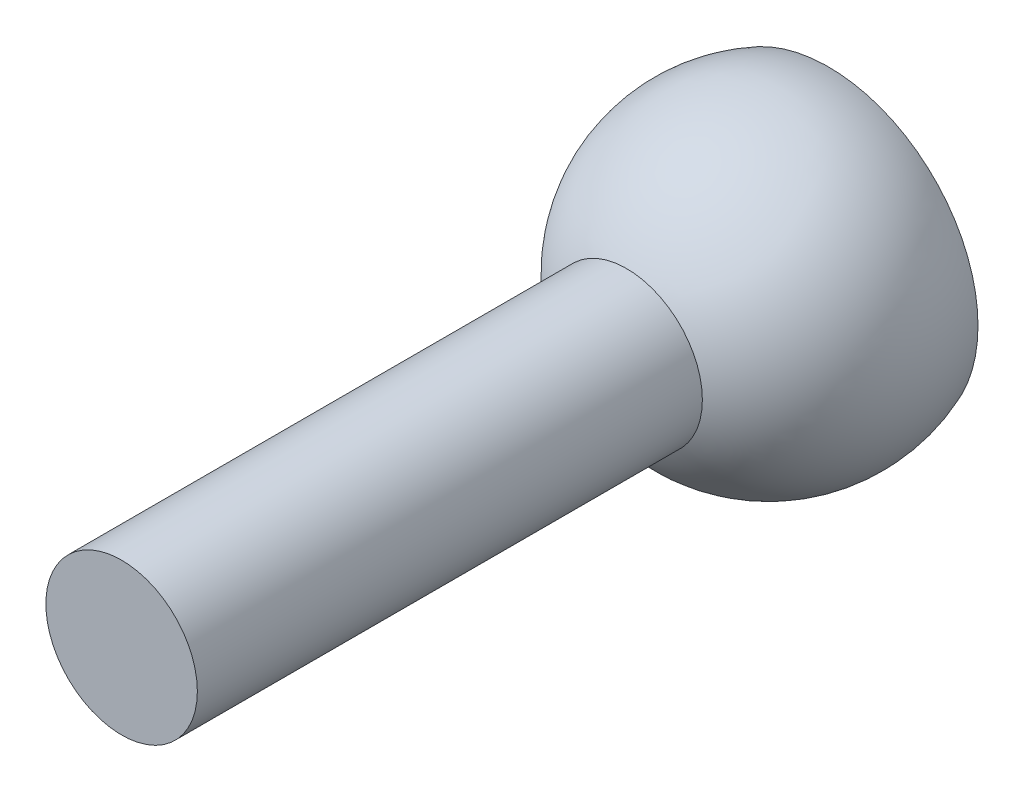
ISO-10303-21;
HEADER;
FILE_DESCRIPTION(('STEP AP214'),'2;1');
FILE_NAME('part.step','',(''),(''),'','','');
FILE_SCHEMA(('AUTOMOTIVE_DESIGN { 1 0 10303 214 1 1 1 1 }'));
ENDSEC;
DATA;
#1=APPLICATION_CONTEXT('core data for automotive mechanical design processes');
#2=APPLICATION_PROTOCOL_DEFINITION('international standard','automotive_design',2000,#1);
#3=PRODUCT_CONTEXT('',#1,'mechanical');
#4=PRODUCT('Part','Part','',(#3));
#5=PRODUCT_RELATED_PRODUCT_CATEGORY('part','',(#4));
#6=PRODUCT_DEFINITION_FORMATION('','',#4);
#7=PRODUCT_DEFINITION_CONTEXT('part definition',#1,'design');
#8=PRODUCT_DEFINITION('design','',#6,#7);
#9=PRODUCT_DEFINITION_SHAPE('','',#8);
#10=(LENGTH_UNIT() NAMED_UNIT(*) SI_UNIT(.MILLI.,.METRE.));
#11=(NAMED_UNIT(*) PLANE_ANGLE_UNIT() SI_UNIT($,.RADIAN.));
#12=(NAMED_UNIT(*) SI_UNIT($,.STERADIAN.) SOLID_ANGLE_UNIT());
#13=UNCERTAINTY_MEASURE_WITH_UNIT(LENGTH_MEASURE(1.E-05),#10,'distance_accuracy_value','');
#14=(GEOMETRIC_REPRESENTATION_CONTEXT(3) GLOBAL_UNCERTAINTY_ASSIGNED_CONTEXT((#13)) GLOBAL_UNIT_ASSIGNED_CONTEXT((#10,
#11,#12)) REPRESENTATION_CONTEXT('',''));
#15=CARTESIAN_POINT('',(0.,0.,0.));
#16=DIRECTION('',(0.,0.,1.));
#17=DIRECTION('',(1.,0.,0.));
#18=AXIS2_PLACEMENT_3D('',#15,#16,#17);
#19=CARTESIAN_POINT('',(0.,0.,10.));
#20=DIRECTION('',(0.,0.,-1.));
#21=DIRECTION('',(-1.,0.,0.));
#22=AXIS2_PLACEMENT_3D('',#19,#20,#21);
#23=CYLINDRICAL_SURFACE('',#22,1.5);
#24=CARTESIAN_POINT('',(0.,0.,10.));
#25=DIRECTION('',(0.,0.,1.));
#26=DIRECTION('',(1.,0.,0.));
#27=AXIS2_PLACEMENT_3D('',#24,#25,#26);
#28=CIRCLE('',#27,1.5);
#29=CARTESIAN_POINT('',(1.5,0.,10.));
#30=VERTEX_POINT('',#29);
#31=EDGE_CURVE('E10',#30,#30,#28,.T.);
#32=ORIENTED_EDGE('',*,*,#31,.F.);
#33=EDGE_LOOP('',(#32));
#34=FACE_BOUND('',#33,.T.);
#35=CARTESIAN_POINT('',(0.,0.,0.));
#36=DIRECTION('',(0.,0.,1.));
#37=DIRECTION('',(1.,0.,0.));
#38=AXIS2_PLACEMENT_3D('',#35,#36,#37);
#39=CIRCLE('',#38,1.5);
#40=CARTESIAN_POINT('',(1.5,0.,0.));
#41=VERTEX_POINT('',#40);
#42=EDGE_CURVE('E41',#41,#41,#39,.T.);
#43=ORIENTED_EDGE('',*,*,#42,.T.);
#44=EDGE_LOOP('',(#43));
#45=FACE_BOUND('',#44,.T.);
#46=ADVANCED_FACE('F33',(#34,#45),#23,.T.);
#47=CARTESIAN_POINT('',(0.,0.,10.));
#48=DIRECTION('',(0.,0.,1.));
#49=DIRECTION('',(1.,0.,0.));
#50=AXIS2_PLACEMENT_3D('',#47,#48,#49);
#51=PLANE('',#50);
#52=ORIENTED_EDGE('',*,*,#31,.T.);
#53=EDGE_LOOP('',(#52));
#54=FACE_BOUND('',#53,.T.);
#55=ADVANCED_FACE('F73',(#54),#51,.T.);
#56=CARTESIAN_POINT('',(0.,0.,-2.8125));
#57=DIRECTION('',(0.,0.,1.));
#58=DIRECTION('',(1.,0.,0.));
#59=AXIS2_PLACEMENT_3D('',#56,#57,#58);
#60=SPHERICAL_SURFACE('',#59,3.1875);
#61=CARTESIAN_POINT('',(0.,0.,-4.));
#62=DIRECTION('',(0.,0.,1.));
#63=DIRECTION('',(1.,0.,0.));
#64=AXIS2_PLACEMENT_3D('',#61,#62,#63);
#65=CIRCLE('',#64,2.95803989154981);
#66=CARTESIAN_POINT('',(2.95803989154981,0.,-4.));
#67=VERTEX_POINT('',#66);
#68=EDGE_CURVE('E37',#67,#67,#65,.T.);
#69=CARTESIAN_POINT('',(2.95803989154981,0.,-4.));
#70=CARTESIAN_POINT('',(2.97613265108618,0.,-3.95493351295893));
#71=CARTESIAN_POINT('',(2.9931939582805,0.,-3.90945302215849));
#72=CARTESIAN_POINT('',(3.02522148361788,0.,-3.81776023265633));
#73=CARTESIAN_POINT('',(3.04018770176093,0.,-3.7715479339546));
#74=CARTESIAN_POINT('',(3.06799286462857,0.,-3.6784877282673));
#75=CARTESIAN_POINT('',(3.08083180935316,0.,-3.63163982128173));
#76=CARTESIAN_POINT('',(3.10435585674361,0.,-3.53740633578886));
#77=CARTESIAN_POINT('',(3.11504095940948,0.,-3.49002075728156));
#78=CARTESIAN_POINT('',(3.13423493854528,0.,-3.39481087878805));
#79=CARTESIAN_POINT('',(3.14274381501522,0.,-3.34698657880184));
#80=CARTESIAN_POINT('',(3.15756758724297,0.,-3.25099915314675));
#81=CARTESIAN_POINT('',(3.16388248300078,0.,-3.20283602747787));
#82=CARTESIAN_POINT('',(3.17430509925104,0.,-3.10627154607242));
#83=CARTESIAN_POINT('',(3.1784128197435,0.,-3.05787019033584));
#84=CARTESIAN_POINT('',(3.18441250703331,0.,-2.96093034410718));
#85=CARTESIAN_POINT('',(3.18630447383065,0.,-2.91239185361509));
#86=CARTESIAN_POINT('',(3.1878687016778,0.,-2.8152791190523));
#87=CARTESIAN_POINT('',(3.18754096272761,0.,-2.76670487498159));
#88=CARTESIAN_POINT('',(3.18466646371267,0.,-2.66962208926774));
#89=CARTESIAN_POINT('',(3.18211970364791,0.,-2.6211135476246));
#90=CARTESIAN_POINT('',(3.17481248174198,0.,-2.52426348550022));
#91=CARTESIAN_POINT('',(3.17005201990081,0.,-2.47592196501898));
#92=CARTESIAN_POINT('',(3.15832733752244,0.,-2.37950691511014));
#93=CARTESIAN_POINT('',(3.15136311698524,0.,-2.33143338568254));
#94=CARTESIAN_POINT('',(3.13524546323002,0.,-2.23565472802265));
#95=CARTESIAN_POINT('',(3.12609203001201,0.,-2.18794959979036));
#96=CARTESIAN_POINT('',(3.10561506947383,0.,-2.09300738519195));
#97=CARTESIAN_POINT('',(3.09429154215367,0.,-2.04577029882584));
#98=CARTESIAN_POINT('',(3.06949804461797,0.,-1.95186283104148));
#99=CARTESIAN_POINT('',(3.05602807440242,0.,-1.90519244962324));
#100=CARTESIAN_POINT('',(3.02696982551174,0.,-1.81251587115202));
#101=CARTESIAN_POINT('',(3.0113815468366,0.,-1.76650967409903));
#102=CARTESIAN_POINT('',(2.97811923992763,0.,-1.67525755650816));
#103=CARTESIAN_POINT('',(2.9604452116938,0.,-1.63001163597027));
#104=CARTESIAN_POINT('',(2.92304832102835,0.,-1.54037457558629));
#105=CARTESIAN_POINT('',(2.90332545859675,0.,-1.49598343574019));
#106=CARTESIAN_POINT('',(2.86187209425241,0.,-1.40814865555455));
#107=CARTESIAN_POINT('',(2.84014159233967,0.,-1.36470501521502));
#108=CARTESIAN_POINT('',(2.794718337063,0.,-1.27885597383539));
#109=CARTESIAN_POINT('',(2.77102558369907,0.,-1.23645057279529));
#110=CARTESIAN_POINT('',(2.72172731206183,0.,-1.15276658125996));
#111=CARTESIAN_POINT('',(2.69612179378852,0.,-1.11148799076474));
#112=CARTESIAN_POINT('',(2.6430514740263,0.,-1.0301438380177));
#113=CARTESIAN_POINT('',(2.61558667253739,0.,-0.990078275765885));
#114=CARTESIAN_POINT('',(2.55885515147791,0.,-0.911243863585951));
#115=CARTESIAN_POINT('',(2.52958843190733,0.,-0.872475013657828));
#116=CARTESIAN_POINT('',(2.46931420346268,0.,-0.796315001762144));
#117=CARTESIAN_POINT('',(2.43830669458861,0.,-0.758923839794583));
#118=CARTESIAN_POINT('',(2.37461565220124,0.,-0.685597302015735));
#119=CARTESIAN_POINT('',(2.34193211868796,0.,-0.649661926204447));
#120=CARTESIAN_POINT('',(2.27495729259755,0.,-0.579322017869483));
#121=CARTESIAN_POINT('',(2.24066600002042,0.,-0.544917485345807));
#122=CARTESIAN_POINT('',(2.17054727859372,0.,-0.477711124753303));
#123=CARTESIAN_POINT('',(2.13471984974415,0.,-0.444909296684474));
#124=CARTESIAN_POINT('',(2.06160369032637,0.,-0.380976853129221));
#125=CARTESIAN_POINT('',(2.02431495975817,0.,-0.349846237642795));
#126=CARTESIAN_POINT('',(1.94835407145073,0.,-0.289321257301133));
#127=CARTESIAN_POINT('',(1.90968191371149,0.,-0.259926892445895));
#128=CARTESIAN_POINT('',(1.83103498065849,0.,-0.202935748264347));
#129=CARTESIAN_POINT('',(1.79106020534474,0.,-0.175338968938035));
#130=CARTESIAN_POINT('',(1.70989139762596,0.,-0.122000862314632));
#131=CARTESIAN_POINT('',(1.66869736522093,0.,-0.0962595350175405));
#132=CARTESIAN_POINT('',(1.58517658437426,0.,-0.0466852554697158));
#133=CARTESIAN_POINT('',(1.54284983593261,0.,-0.022852303218983));
#134=CARTESIAN_POINT('',(1.5,0.,0.));
#135=B_SPLINE_CURVE_WITH_KNOTS('',3,(#69,#70,#71,#72,#73,#74,#75,#76,#77,#78,#79,#80,#81,#82,
#83,#84,#85,#86,#87,#88,#89,#90,#91,#92,#93,#94,#95,#96,#97,#98,#99,#100,#101,#102,#103,#104,
#105,#106,#107,#108,#109,#110,#111,#112,#113,#114,#115,#116,#117,#118,#119,#120,#121,#122,#123,
#124,#125,#126,#127,#128,#129,#130,#131,#132,#133,#134),.UNSPECIFIED.,.F.,.F.,(4,2,2,2,2,2,2,2,
2,2,2,2,2,2,2,2,2,2,2,2,2,2,2,2,2,2,2,2,2,2,2,2,4),(0.,0.145675319984637,0.291350639969274,
0.437025959953911,0.582701279938548,0.728376599923185,0.874051919907822,1.01972723989246,
1.1654025598771,1.31107787986173,1.45675319984637,1.60242851983101,1.74810383981564,
1.89377915980028,2.03945447978492,2.18512979976956,2.33080511975419,2.47648043973883,
2.62215575972347,2.7678310797081,2.91350639969274,3.05918171967738,3.20485703966202,
3.35053235964665,3.49620767963129,3.64188299961593,3.78755831960056,3.9332336395852,
4.07890895956984,4.22458427955448,4.37025959953911,4.51593491952375,4.66161023950839),.UNSPECIFIED.);
#136=EDGE_CURVE('BSEAM35',#67,#41,#135,.T.);
#137=ORIENTED_EDGE('',*,*,#68,.T.);
#138=ORIENTED_EDGE('',*,*,#42,.F.);
#139=ORIENTED_EDGE('',*,*,#136,.T.);
#140=ORIENTED_EDGE('',*,*,#136,.F.);
#141=EDGE_LOOP('',(#137,#139,#138,#140));
#142=FACE_BOUND('',#141,.T.);
#143=ADVANCED_FACE('F35',(#142),#60,.T.);
#144=CARTESIAN_POINT('',(0.,0.,-4.));
#145=DIRECTION('',(0.,0.,1.));
#146=DIRECTION('',(1.,0.,0.));
#147=AXIS2_PLACEMENT_3D('',#144,#145,#146);
#148=PLANE('',#147);
#149=CARTESIAN_POINT('',(0.,0.,-4.));
#150=DIRECTION('',(0.,0.,1.));
#151=DIRECTION('',(1.,0.,0.));
#152=AXIS2_PLACEMENT_3D('',#149,#150,#151);
#153=CIRCLE('',#152,2.41091269024824);
#154=CARTESIAN_POINT('',(2.41091269024824,0.,-4.));
#155=VERTEX_POINT('',#154);
#156=EDGE_CURVE('E47',#155,#155,#153,.T.);
#157=ORIENTED_EDGE('',*,*,#156,.T.);
#158=EDGE_LOOP('',(#157));
#159=FACE_BOUND('',#158,.T.);
#160=ORIENTED_EDGE('',*,*,#68,.F.);
#161=EDGE_LOOP('',(#160));
#162=FACE_BOUND('',#161,.T.);
#163=ADVANCED_FACE('F62',(#159,#162),#148,.F.);
#164=CARTESIAN_POINT('',(0.,0.,10.));
#165=DIRECTION('',(0.,0.,-1.));
#166=DIRECTION('',(-1.,0.,0.));
#167=AXIS2_PLACEMENT_3D('',#164,#165,#166);
#168=CYLINDRICAL_SURFACE('',#167,1.);
#169=CARTESIAN_POINT('',(0.,0.,9.5));
#170=DIRECTION('',(0.,0.,1.));
#171=DIRECTION('',(1.,0.,0.));
#172=AXIS2_PLACEMENT_3D('',#169,#170,#171);
#173=CIRCLE('',#172,1.);
#174=CARTESIAN_POINT('',(1.,0.,9.5));
#175=VERTEX_POINT('',#174);
#176=EDGE_CURVE('E53',#175,#175,#173,.T.);
#177=ORIENTED_EDGE('',*,*,#176,.T.);
#178=EDGE_LOOP('',(#177));
#179=FACE_BOUND('',#178,.T.);
#180=CARTESIAN_POINT('',(0.,0.,-0.317974744565612));
#181=DIRECTION('',(0.,0.,-1.));
#182=DIRECTION('',(-1.,0.,0.));
#183=AXIS2_PLACEMENT_3D('',#180,#181,#182);
#184=CIRCLE('',#183,1.);
#185=CARTESIAN_POINT('',(1.,0.,-0.317974744565612));
#186=VERTEX_POINT('',#185);
#187=EDGE_CURVE('E50',#186,#186,#184,.F.);
#188=ORIENTED_EDGE('',*,*,#187,.F.);
#189=EDGE_LOOP('',(#188));
#190=FACE_BOUND('',#189,.T.);
#191=ADVANCED_FACE('F64',(#179,#190),#168,.F.);
#192=CARTESIAN_POINT('',(0.,0.,9.5));
#193=DIRECTION('',(0.,0.,1.));
#194=DIRECTION('',(1.,0.,0.));
#195=AXIS2_PLACEMENT_3D('',#192,#193,#194);
#196=PLANE('',#195);
#197=ORIENTED_EDGE('',*,*,#176,.F.);
#198=EDGE_LOOP('',(#197));
#199=FACE_BOUND('',#198,.T.);
#200=ADVANCED_FACE('F71',(#199),#196,.F.);
#201=CARTESIAN_POINT('',(0.,0.,-2.8125));
#202=DIRECTION('',(0.,0.,1.));
#203=DIRECTION('',(1.,0.,0.));
#204=AXIS2_PLACEMENT_3D('',#201,#202,#203);
#205=SPHERICAL_SURFACE('',#204,2.6875);
#206=CARTESIAN_POINT('',(2.41091269024824,0.,-4.));
#207=CARTESIAN_POINT('',(2.43128930839686,0.,-3.9586330810894));
#208=CARTESIAN_POINT('',(2.450599198756,0.,-3.91674085540468));
#209=CARTESIAN_POINT('',(2.48703892469577,0.,-3.83201872652443));
#210=CARTESIAN_POINT('',(2.50416876027641,0.,-3.78918882332889));
#211=CARTESIAN_POINT('',(2.53620177745968,0.,-3.70270427546438));
#212=CARTESIAN_POINT('',(2.55110495906232,0.,-3.65904963079542));
#213=CARTESIAN_POINT('',(2.5786455151927,0.,-3.57103138643717));
#214=CARTESIAN_POINT('',(2.59128288972046,0.,-3.52666778674789));
#215=CARTESIAN_POINT('',(2.61425826632771,0.,-3.43734911855566));
#216=CARTESIAN_POINT('',(2.62459626840721,0.,-3.39239405005271));
#217=CARTESIAN_POINT('',(2.64294553712941,0.,-3.30201154509068));
#218=CARTESIAN_POINT('',(2.6509568037721,0.,-3.2565841086316));
#219=CARTESIAN_POINT('',(2.66463137263195,0.,-3.16537720716328));
#220=CARTESIAN_POINT('',(2.67029467484912,0.,-3.11959774215405));
#221=CARTESIAN_POINT('',(2.67925831385357,0.,-3.02780805898345));
#222=CARTESIAN_POINT('',(2.68255865064086,0.,-2.98179784082209));
#223=CARTESIAN_POINT('',(2.68678761539063,0.,-2.88966853711559));
#224=CARTESIAN_POINT('',(2.68771624335311,0.,-2.84354945157045));
#225=CARTESIAN_POINT('',(2.68719933054002,0.,-2.75132458751236));
#226=CARTESIAN_POINT('',(2.68575378976445,0.,-2.70521880899941));
#227=CARTESIAN_POINT('',(2.68049236883414,0.,-2.61314269810391));
#228=CARTESIAN_POINT('',(2.67667648867939,0.,-2.56717236572135));
#229=CARTESIAN_POINT('',(2.66668449767188,0.,-2.47548892739134));
#230=CARTESIAN_POINT('',(2.66050838681912,0.,-2.42977582144388));
#231=CARTESIAN_POINT('',(2.64581229558794,0.,-2.33872793486382));
#232=CARTESIAN_POINT('',(2.63729231520952,0.,-2.29339315423121));
#233=CARTESIAN_POINT('',(2.61793105526206,0.,-2.20322201493788));
#234=CARTESIAN_POINT('',(2.60708977569301,0.,-2.15838565627715));
#235=CARTESIAN_POINT('',(2.58311463706703,0.,-2.06933013721143));
#236=CARTESIAN_POINT('',(2.56998077801009,0.,-2.02511097680644));
#237=CARTESIAN_POINT('',(2.54145527339824,0.,-1.9374069955123));
#238=CARTESIAN_POINT('',(2.52606362784333,0.,-1.89392217462315));
#239=CARTESIAN_POINT('',(2.493063324342,0.,-1.8078020682773));
#240=CARTESIAN_POINT('',(2.47545466639558,0.,-1.76516678282058));
#241=CARTESIAN_POINT('',(2.43806698531942,0.,-1.68085869274644));
#242=CARTESIAN_POINT('',(2.41828796218967,0.,-1.63918588812901));
#243=CARTESIAN_POINT('',(2.37661194748326,0.,-1.55691315542618));
#244=CARTESIAN_POINT('',(2.35471495590659,0.,-1.51631322734079));
#245=CARTESIAN_POINT('',(2.30886101176657,0.,-1.43629380123053));
#246=CARTESIAN_POINT('',(2.28490405920321,0.,-1.39687430320567));
#247=CARTESIAN_POINT('',(2.23499365760549,0.,-1.31932016366092));
#248=CARTESIAN_POINT('',(2.20904020857112,0.,-1.28118552214104));
#249=CARTESIAN_POINT('',(2.15520556747994,0.,-1.20630211832624));
#250=CARTESIAN_POINT('',(2.12732437542312,0.,-1.16955335603132));
#251=CARTESIAN_POINT('',(2.06970810852693,0.,-1.09753906205579));
#252=CARTESIAN_POINT('',(2.03997303368755,0.,-1.06227353037518));
#253=CARTESIAN_POINT('',(1.9787277726176,0.,-0.993319119741322));
#254=CARTESIAN_POINT('',(1.94721758638703,0.,-0.959630240788067));
#255=CARTESIAN_POINT('',(1.88250557631492,0.,-0.893918381152792));
#256=CARTESIAN_POINT('',(1.84930375247338,0.,-0.861895400470771));
#257=CARTESIAN_POINT('',(1.78129642254901,0.,-0.799600169214132));
#258=CARTESIAN_POINT('',(1.74649091646617,0.,-0.769327918639515));
#259=CARTESIAN_POINT('',(1.67536842477802,0.,-0.710614343675776));
#260=CARTESIAN_POINT('',(1.63905143917269,0.,-0.682173019286656));
#261=CARTESIAN_POINT('',(1.56500219886986,0.,-0.627196634570817));
#262=CARTESIAN_POINT('',(1.52726994417235,0.,-0.600661574244099));
#263=CARTESIAN_POINT('',(1.45049011172379,0.,-0.549568035053222));
#264=CARTESIAN_POINT('',(1.41144253397274,0.,-0.525009556189064));
#265=CARTESIAN_POINT('',(1.33213553660516,0.,-0.477934151353644));
#266=CARTESIAN_POINT('',(1.29187611698864,0.,-0.455417225382383));
#267=CARTESIAN_POINT('',(1.21025193809134,0.,-0.41248489923375));
#268=CARTESIAN_POINT('',(1.16888717881056,0.,-0.392069499056379));
#269=CARTESIAN_POINT('',(1.0851624573691,0.,-0.353393100980552));
#270=CARTESIAN_POINT('',(1.04280249520843,0.,-0.335132103082096));
#271=CARTESIAN_POINT('',(1.,0.,-0.317974744565612));
#272=B_SPLINE_CURVE_WITH_KNOTS('',3,(#206,#207,#208,#209,#210,#211,#212,#213,#214,#215,#216,
#217,#218,#219,#220,#221,#222,#223,#224,#225,#226,#227,#228,#229,#230,#231,#232,#233,#234,#235,
#236,#237,#238,#239,#240,#241,#242,#243,#244,#245,#246,#247,#248,#249,#250,#251,#252,#253,#254,
#255,#256,#257,#258,#259,#260,#261,#262,#263,#264,#265,#266,#267,#268,#269,#270,#271),
.UNSPECIFIED.,.F.,.F.,(4,2,2,2,2,2,2,2,2,2,2,2,2,2,2,2,2,2,2,2,2,2,2,2,2,2,2,2,2,2,2,2,4),(0.,
0.138324201699542,0.276648403399085,0.414972605098627,0.553296806798169,0.691621008497711,
0.829945210197253,0.968269411896795,1.10659361359634,1.24491781529588,1.38324201699542,
1.52156621869496,1.65989042039451,1.79821462209405,1.93653882379359,2.07486302549313,
2.21318722719268,2.35151142889222,2.48983563059176,2.6281598322913,2.76648403399084,
2.90480823569039,3.04313243738993,3.18145663908947,3.31978084078901,3.45810504248856,
3.5964292441881,3.73475344588764,3.87307764758718,4.01140184928673,4.14972605098627,
4.28805025268581,4.42637445438535),.UNSPECIFIED.);
#273=EDGE_CURVE('BSEAM114',#155,#186,#272,.T.);
#274=ORIENTED_EDGE('',*,*,#156,.F.);
#275=ORIENTED_EDGE('',*,*,#187,.T.);
#276=ORIENTED_EDGE('',*,*,#273,.T.);
#277=ORIENTED_EDGE('',*,*,#273,.F.);
#278=EDGE_LOOP('',(#274,#276,#275,#277));
#279=FACE_BOUND('',#278,.T.);
#280=ADVANCED_FACE('F114',(#279),#205,.F.);
#281=CLOSED_SHELL('',(#46,#55,#143,#163,#191,#200,#280));
#282=MANIFOLD_SOLID_BREP('B2',#281);
#283=ADVANCED_BREP_SHAPE_REPRESENTATION('',(#18,#282),#14);
#284=SHAPE_DEFINITION_REPRESENTATION(#9,#283);
ENDSEC;
END-ISO-10303-21;
